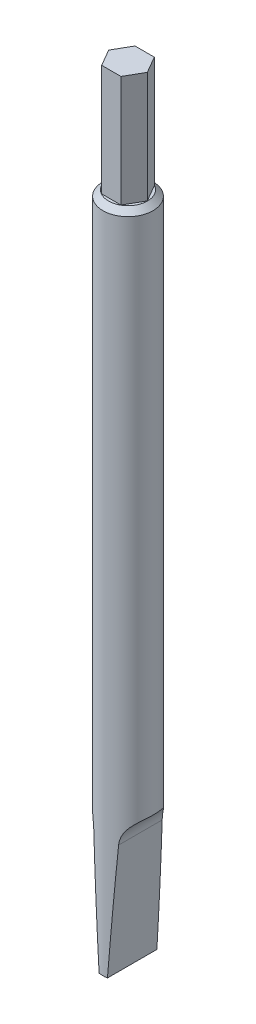
ISO-10303-21;
HEADER;
FILE_DESCRIPTION(('STEP AP214'),'2;1');
FILE_NAME('part.step','',(''),(''),'','','');
FILE_SCHEMA(('AUTOMOTIVE_DESIGN { 1 0 10303 214 1 1 1 1 }'));
ENDSEC;
DATA;
#1=APPLICATION_CONTEXT('core data for automotive mechanical design processes');
#2=APPLICATION_PROTOCOL_DEFINITION('international standard','automotive_design',2000,#1);
#3=PRODUCT_CONTEXT('',#1,'mechanical');
#4=PRODUCT('Part','Part','',(#3));
#5=PRODUCT_RELATED_PRODUCT_CATEGORY('part','',(#4));
#6=PRODUCT_DEFINITION_FORMATION('','',#4);
#7=PRODUCT_DEFINITION_CONTEXT('part definition',#1,'design');
#8=PRODUCT_DEFINITION('design','',#6,#7);
#9=PRODUCT_DEFINITION_SHAPE('','',#8);
#10=(LENGTH_UNIT() NAMED_UNIT(*) SI_UNIT(.MILLI.,.METRE.));
#11=(NAMED_UNIT(*) PLANE_ANGLE_UNIT() SI_UNIT($,.RADIAN.));
#12=(NAMED_UNIT(*) SI_UNIT($,.STERADIAN.) SOLID_ANGLE_UNIT());
#13=UNCERTAINTY_MEASURE_WITH_UNIT(LENGTH_MEASURE(1.E-05),#10,'distance_accuracy_value','');
#14=(GEOMETRIC_REPRESENTATION_CONTEXT(3) GLOBAL_UNCERTAINTY_ASSIGNED_CONTEXT((#13)) GLOBAL_UNIT_ASSIGNED_CONTEXT((#10,
#11,#12)) REPRESENTATION_CONTEXT('',''));
#15=CARTESIAN_POINT('',(0.,0.,0.));
#16=DIRECTION('',(0.,0.,1.));
#17=DIRECTION('',(1.,0.,0.));
#18=AXIS2_PLACEMENT_3D('',#15,#16,#17);
#19=CARTESIAN_POINT('',(0.,20.,3.));
#20=DIRECTION('',(0.,0.,-1.));
#21=DIRECTION('',(-1.,0.,0.));
#22=AXIS2_PLACEMENT_3D('',#19,#20,#21);
#23=PLANE('',#22);
#24=DIRECTION('',(1.,0.,0.));
#25=VECTOR('',#24,1.);
#26=CARTESIAN_POINT('',(0.,0.,3.));
#27=LINE('',#26,#25);
#28=CARTESIAN_POINT('',(-1.73205080756885,0.,3.00000000000002));
#29=VERTEX_POINT('',#28);
#30=CARTESIAN_POINT('',(1.73205080756891,0.,2.99999999999998));
#31=VERTEX_POINT('',#30);
#32=EDGE_CURVE('E167',#29,#31,#27,.T.);
#33=ORIENTED_EDGE('',*,*,#32,.T.);
#34=DIRECTION('',(0.,-1.,0.));
#35=VECTOR('',#34,1.);
#36=CARTESIAN_POINT('',(1.73205080756891,20.,2.99999999999998));
#37=LINE('',#36,#35);
#38=CARTESIAN_POINT('',(1.73205080756891,20.,2.99999999999998));
#39=VERTEX_POINT('',#38);
#40=EDGE_CURVE('E198',#39,#31,#37,.T.);
#41=ORIENTED_EDGE('',*,*,#40,.F.);
#42=DIRECTION('',(1.,0.,0.));
#43=VECTOR('',#42,1.);
#44=CARTESIAN_POINT('',(0.,20.,3.));
#45=LINE('',#44,#43);
#46=CARTESIAN_POINT('',(-1.73205080756885,20.,3.00000000000002));
#47=VERTEX_POINT('',#46);
#48=EDGE_CURVE('E152',#47,#39,#45,.T.);
#49=ORIENTED_EDGE('',*,*,#48,.F.);
#50=DIRECTION('',(0.,-1.,0.));
#51=VECTOR('',#50,1.);
#52=CARTESIAN_POINT('',(-1.73205080756885,20.,3.00000000000002));
#53=LINE('',#52,#51);
#54=EDGE_CURVE('E166',#47,#29,#53,.T.);
#55=ORIENTED_EDGE('',*,*,#54,.T.);
#56=EDGE_LOOP('',(#33,#41,#49,#55));
#57=FACE_BOUND('',#56,.T.);
#58=ADVANCED_FACE('F44',(#57),#23,.F.);
#59=CARTESIAN_POINT('',(2.59807621135334,20.,1.49999999999999));
#60=DIRECTION('',(-0.866025403784442,0.,-0.499999999999995));
#61=DIRECTION('',(-0.499999999999995,0.,0.866025403784442));
#62=AXIS2_PLACEMENT_3D('',#59,#60,#61);
#63=PLANE('',#62);
#64=DIRECTION('',(0.499999999999995,0.,-0.866025403784442));
#65=VECTOR('',#64,1.);
#66=CARTESIAN_POINT('',(2.59807621135334,0.,1.49999999999999));
#67=LINE('',#66,#65);
#68=CARTESIAN_POINT('',(3.46410161513776,0.,0.));
#69=VERTEX_POINT('',#68);
#70=EDGE_CURVE('E170',#31,#69,#67,.T.);
#71=ORIENTED_EDGE('',*,*,#70,.T.);
#72=DIRECTION('',(0.,-1.,0.));
#73=VECTOR('',#72,1.);
#74=CARTESIAN_POINT('',(3.46410161513776,20.,0.));
#75=LINE('',#74,#73);
#76=CARTESIAN_POINT('',(3.46410161513776,20.,0.));
#77=VERTEX_POINT('',#76);
#78=EDGE_CURVE('E195',#77,#69,#75,.T.);
#79=ORIENTED_EDGE('',*,*,#78,.F.);
#80=DIRECTION('',(0.499999999999995,0.,-0.866025403784442));
#81=VECTOR('',#80,1.);
#82=CARTESIAN_POINT('',(2.59807621135334,20.,1.49999999999999));
#83=LINE('',#82,#81);
#84=EDGE_CURVE('E155',#39,#77,#83,.T.);
#85=ORIENTED_EDGE('',*,*,#84,.F.);
#86=ORIENTED_EDGE('',*,*,#40,.T.);
#87=EDGE_LOOP('',(#71,#79,#85,#86));
#88=FACE_BOUND('',#87,.T.);
#89=ADVANCED_FACE('F242',(#88),#63,.F.);
#90=CARTESIAN_POINT('',(2.59807621135331,20.,-1.5));
#91=DIRECTION('',(-0.866025403784438,0.,0.500000000000001));
#92=DIRECTION('',(0.500000000000001,0.,0.866025403784438));
#93=AXIS2_PLACEMENT_3D('',#90,#91,#92);
#94=PLANE('',#93);
#95=DIRECTION('',(-0.500000000000001,0.,-0.866025403784438));
#96=VECTOR('',#95,1.);
#97=CARTESIAN_POINT('',(2.59807621135331,0.,-1.5));
#98=LINE('',#97,#96);
#99=CARTESIAN_POINT('',(1.73205080756887,0.,-3.00000000000001));
#100=VERTEX_POINT('',#99);
#101=EDGE_CURVE('E173',#69,#100,#98,.T.);
#102=ORIENTED_EDGE('',*,*,#101,.T.);
#103=DIRECTION('',(0.,-1.,0.));
#104=VECTOR('',#103,1.);
#105=CARTESIAN_POINT('',(1.73205080756887,20.,-3.00000000000001));
#106=LINE('',#105,#104);
#107=CARTESIAN_POINT('',(1.73205080756887,20.,-3.00000000000001));
#108=VERTEX_POINT('',#107);
#109=EDGE_CURVE('E192',#108,#100,#106,.T.);
#110=ORIENTED_EDGE('',*,*,#109,.F.);
#111=DIRECTION('',(-0.500000000000001,0.,-0.866025403784438));
#112=VECTOR('',#111,1.);
#113=CARTESIAN_POINT('',(2.59807621135331,20.,-1.5));
#114=LINE('',#113,#112);
#115=EDGE_CURVE('E158',#77,#108,#114,.T.);
#116=ORIENTED_EDGE('',*,*,#115,.F.);
#117=ORIENTED_EDGE('',*,*,#78,.T.);
#118=EDGE_LOOP('',(#102,#110,#116,#117));
#119=FACE_BOUND('',#118,.T.);
#120=ADVANCED_FACE('F247',(#119),#94,.F.);
#121=CARTESIAN_POINT('',(0.,20.,-3.));
#122=DIRECTION('',(0.,0.,1.));
#123=DIRECTION('',(1.,0.,0.));
#124=AXIS2_PLACEMENT_3D('',#121,#122,#123);
#125=PLANE('',#124);
#126=DIRECTION('',(-1.,0.,0.));
#127=VECTOR('',#126,1.);
#128=CARTESIAN_POINT('',(0.,0.,-3.));
#129=LINE('',#128,#127);
#130=CARTESIAN_POINT('',(-1.73205080756889,0.,-3.));
#131=VERTEX_POINT('',#130);
#132=EDGE_CURVE('E176',#100,#131,#129,.T.);
#133=ORIENTED_EDGE('',*,*,#132,.T.);
#134=DIRECTION('',(0.,-1.,0.));
#135=VECTOR('',#134,1.);
#136=CARTESIAN_POINT('',(-1.73205080756889,20.,-3.));
#137=LINE('',#136,#135);
#138=CARTESIAN_POINT('',(-1.73205080756889,20.,-3.));
#139=VERTEX_POINT('',#138);
#140=EDGE_CURVE('E189',#139,#131,#137,.T.);
#141=ORIENTED_EDGE('',*,*,#140,.F.);
#142=DIRECTION('',(-1.,0.,0.));
#143=VECTOR('',#142,1.);
#144=CARTESIAN_POINT('',(0.,20.,-3.));
#145=LINE('',#144,#143);
#146=EDGE_CURVE('E160',#108,#139,#145,.T.);
#147=ORIENTED_EDGE('',*,*,#146,.F.);
#148=ORIENTED_EDGE('',*,*,#109,.T.);
#149=EDGE_LOOP('',(#133,#141,#147,#148));
#150=FACE_BOUND('',#149,.T.);
#151=ADVANCED_FACE('F253',(#150),#125,.F.);
#152=CARTESIAN_POINT('',(-2.59807621135333,20.,-1.49999999999998));
#153=DIRECTION('',(0.866025403784442,0.,0.499999999999995));
#154=DIRECTION('',(0.499999999999995,0.,-0.866025403784442));
#155=AXIS2_PLACEMENT_3D('',#152,#153,#154);
#156=PLANE('',#155);
#157=DIRECTION('',(-0.499999999999995,0.,0.866025403784442));
#158=VECTOR('',#157,1.);
#159=CARTESIAN_POINT('',(-2.59807621135333,0.,-1.49999999999998));
#160=LINE('',#159,#158);
#161=CARTESIAN_POINT('',(-3.46410161513776,0.,0.));
#162=VERTEX_POINT('',#161);
#163=EDGE_CURVE('E179',#131,#162,#160,.T.);
#164=ORIENTED_EDGE('',*,*,#163,.T.);
#165=DIRECTION('',(0.,-1.,0.));
#166=VECTOR('',#165,1.);
#167=CARTESIAN_POINT('',(-3.46410161513776,20.,0.));
#168=LINE('',#167,#166);
#169=CARTESIAN_POINT('',(-3.46410161513776,20.,0.));
#170=VERTEX_POINT('',#169);
#171=EDGE_CURVE('E186',#170,#162,#168,.T.);
#172=ORIENTED_EDGE('',*,*,#171,.F.);
#173=DIRECTION('',(-0.499999999999995,0.,0.866025403784442));
#174=VECTOR('',#173,1.);
#175=CARTESIAN_POINT('',(-2.59807621135333,20.,-1.49999999999998));
#176=LINE('',#175,#174);
#177=EDGE_CURVE('E162',#139,#170,#176,.T.);
#178=ORIENTED_EDGE('',*,*,#177,.F.);
#179=ORIENTED_EDGE('',*,*,#140,.T.);
#180=EDGE_LOOP('',(#164,#172,#178,#179));
#181=FACE_BOUND('',#180,.T.);
#182=ADVANCED_FACE('F257',(#181),#156,.F.);
#183=CARTESIAN_POINT('',(-2.5980762113533,20.,1.50000000000002));
#184=DIRECTION('',(0.866025403784434,0.,-0.500000000000007));
#185=DIRECTION('',(-0.500000000000007,0.,-0.866025403784435));
#186=AXIS2_PLACEMENT_3D('',#183,#184,#185);
#187=PLANE('',#186);
#188=DIRECTION('',(0.500000000000007,0.,0.866025403784435));
#189=VECTOR('',#188,1.);
#190=CARTESIAN_POINT('',(-2.5980762113533,0.,1.50000000000002));
#191=LINE('',#190,#189);
#192=EDGE_CURVE('E156',#162,#29,#191,.T.);
#193=ORIENTED_EDGE('',*,*,#192,.T.);
#194=ORIENTED_EDGE('',*,*,#54,.F.);
#195=DIRECTION('',(0.500000000000007,0.,0.866025403784435));
#196=VECTOR('',#195,1.);
#197=CARTESIAN_POINT('',(-2.5980762113533,20.,1.50000000000002));
#198=LINE('',#197,#196);
#199=EDGE_CURVE('E164',#170,#47,#198,.T.);
#200=ORIENTED_EDGE('',*,*,#199,.F.);
#201=ORIENTED_EDGE('',*,*,#171,.T.);
#202=EDGE_LOOP('',(#193,#194,#200,#201));
#203=FACE_BOUND('',#202,.T.);
#204=ADVANCED_FACE('F238',(#203),#187,.F.);
#205=CARTESIAN_POINT('',(0.,20.,0.));
#206=DIRECTION('',(0.,1.,0.));
#207=DIRECTION('',(0.,0.,1.));
#208=AXIS2_PLACEMENT_3D('',#205,#206,#207);
#209=PLANE('',#208);
#210=ORIENTED_EDGE('',*,*,#48,.T.);
#211=ORIENTED_EDGE('',*,*,#84,.T.);
#212=ORIENTED_EDGE('',*,*,#115,.T.);
#213=ORIENTED_EDGE('',*,*,#146,.T.);
#214=ORIENTED_EDGE('',*,*,#177,.T.);
#215=ORIENTED_EDGE('',*,*,#199,.T.);
#216=EDGE_LOOP('',(#210,#211,#212,#213,#214,#215));
#217=FACE_BOUND('',#216,.T.);
#218=ADVANCED_FACE('F230',(#217),#209,.T.);
#219=CARTESIAN_POINT('',(0.,0.,0.));
#220=DIRECTION('',(0.,1.,0.));
#221=DIRECTION('',(0.,0.,1.));
#222=AXIS2_PLACEMENT_3D('',#219,#220,#221);
#223=PLANE('',#222);
#224=CARTESIAN_POINT('',(0.,0.,0.));
#225=DIRECTION('',(0.,1.,0.));
#226=DIRECTION('',(0.,0.,1.));
#227=AXIS2_PLACEMENT_3D('',#224,#225,#226);
#228=CIRCLE('',#227,3.5);
#229=CARTESIAN_POINT('',(0.,0.,3.5));
#230=VERTEX_POINT('',#229);
#231=EDGE_CURVE('E201',#230,#230,#228,.T.);
#232=ORIENTED_EDGE('',*,*,#231,.T.);
#233=EDGE_LOOP('',(#232));
#234=FACE_BOUND('',#233,.T.);
#235=ORIENTED_EDGE('',*,*,#32,.F.);
#236=ORIENTED_EDGE('',*,*,#192,.F.);
#237=ORIENTED_EDGE('',*,*,#163,.F.);
#238=ORIENTED_EDGE('',*,*,#132,.F.);
#239=ORIENTED_EDGE('',*,*,#101,.F.);
#240=ORIENTED_EDGE('',*,*,#70,.F.);
#241=EDGE_LOOP('',(#235,#236,#237,#238,#239,#240));
#242=FACE_BOUND('',#241,.T.);
#243=ADVANCED_FACE('F228',(#234,#242),#223,.T.);
#244=CARTESIAN_POINT('',(0.,-120.,0.));
#245=DIRECTION('',(0.,1.,0.));
#246=DIRECTION('',(0.,0.,1.));
#247=AXIS2_PLACEMENT_3D('',#244,#245,#246);
#248=CYLINDRICAL_SURFACE('',#247,4.5);
#249=CARTESIAN_POINT('',(0.,-130.725499692534,0.));
#250=DIRECTION('',(-0.997564050259824,0.0697564737441254,0.));
#251=DIRECTION('',(0.0697564737441254,0.997564050259824,0.));
#252=AXIS2_PLACEMENT_3D('',#249,#250,#251);
#253=ELLIPSE('',#252,64.5101416179164,4.5);
#254=CARTESIAN_POINT('',(2.22904475760738,-98.8486745427175,3.90913794443008));
#255=VERTEX_POINT('',#254);
#256=CARTESIAN_POINT('',(0.75,-120.,4.43705983732471));
#257=VERTEX_POINT('',#256);
#258=EDGE_CURVE('E74',#255,#257,#253,.F.);
#259=ORIENTED_EDGE('',*,*,#258,.F.);
#260=CARTESIAN_POINT('',(2.22904475760738,-98.8486745427175,-3.90913794443008));
#261=CARTESIAN_POINT('',(2.23702621646611,-98.7342787867654,-3.90455301412368));
#262=CARTESIAN_POINT('',(2.24897237830165,-98.6202409171083,-3.89774124246853));
#263=CARTESIAN_POINT('',(2.28058564520321,-98.3935946749973,-3.87934716952942));
#264=CARTESIAN_POINT('',(2.30025513874391,-98.280986755894,-3.86776339242702));
#265=CARTESIAN_POINT('',(2.34719584400133,-98.0575363098172,-3.83945395370796));
#266=CARTESIAN_POINT('',(2.37449738593554,-97.9467027315231,-3.82270774842751));
#267=CARTESIAN_POINT('',(2.436298436684,-97.7280755292207,-3.78362142886619));
#268=CARTESIAN_POINT('',(2.47079727307929,-97.6202816222934,-3.76128183711757));
#269=CARTESIAN_POINT('',(2.54660406210751,-97.4082165609079,-3.71037687082037));
#270=CARTESIAN_POINT('',(2.5879331727381,-97.3039576056024,-3.68179205909015));
#271=CARTESIAN_POINT('',(2.67661907337466,-97.1001945116027,-3.61783051026291));
#272=CARTESIAN_POINT('',(2.72397536155994,-97.0006899780045,-3.58245433848763));
#273=CARTESIAN_POINT('',(2.8236902240112,-96.8075192575303,-3.50439309765484));
#274=CARTESIAN_POINT('',(2.87603716753399,-96.7138402977946,-3.46172484722608));
#275=CARTESIAN_POINT('',(2.9846830410643,-96.5329182426583,-3.36849906138687));
#276=CARTESIAN_POINT('',(3.0409815500217,-96.445674463597,-3.31794236581187));
#277=CARTESIAN_POINT('',(3.15218326142481,-96.2841591543176,-3.2123516689926));
#278=CARTESIAN_POINT('',(3.20691354791847,-96.2094077407047,-3.15786937601235));
#279=CARTESIAN_POINT('',(3.31737747759323,-96.0666193508308,-3.04161662066168));
#280=CARTESIAN_POINT('',(3.37311101683262,-95.9985816836744,-2.97984690966111));
#281=CARTESIAN_POINT('',(3.48426592602755,-95.8695508433399,-2.84907936053104));
#282=CARTESIAN_POINT('',(3.53968727940563,-95.8085580409603,-2.78008114230142));
#283=CARTESIAN_POINT('',(3.64887642748707,-95.6937825954873,-2.6351337042114));
#284=CARTESIAN_POINT('',(3.70264431849602,-95.6399995318489,-2.55918489021543));
#285=CARTESIAN_POINT('',(3.80240311983273,-95.5442692448825,-2.40814230508481));
#286=CARTESIAN_POINT('',(3.84865318926925,-95.5016872490807,-2.33362025159587));
#287=CARTESIAN_POINT('',(3.93788764806116,-95.4222911569372,-2.17966921272709));
#288=CARTESIAN_POINT('',(3.98087099331313,-95.3854789007471,-2.10023867309235));
#289=CARTESIAN_POINT('',(4.06277994182616,-95.3174332764952,-1.93704749879922));
#290=CARTESIAN_POINT('',(4.10170651974433,-95.2861985671095,-1.85328791148238));
#291=CARTESIAN_POINT('',(4.17488472425591,-95.229017157265,-1.68196842738293));
#292=CARTESIAN_POINT('',(4.20913455413967,-95.2030724872524,-1.59440708697675));
#293=CARTESIAN_POINT('',(4.27279286567596,-95.1559191061295,-1.4150627178379));
#294=CARTESIAN_POINT('',(4.30213927068602,-95.1347700620595,-1.32324199674026));
#295=CARTESIAN_POINT('',(4.35507754079025,-95.0973075393073,-1.13696065361347));
#296=CARTESIAN_POINT('',(4.37866744162889,-95.0809957107901,-1.04249914270451));
#297=CARTESIAN_POINT('',(4.41976539080912,-95.0529601985634,-0.851591587608721));
#298=CARTESIAN_POINT('',(4.43727323385288,-95.0412366697288,-0.755145476548752));
#299=CARTESIAN_POINT('',(4.46598738167682,-95.0221761964408,-0.560890393805394));
#300=CARTESIAN_POINT('',(4.47719343889635,-95.0148394243169,-0.463081368735668));
#301=CARTESIAN_POINT('',(4.49360841061999,-95.0041316886795,-0.261310371063095));
#302=CARTESIAN_POINT('',(4.49845362158803,-95.001001013529,-0.157305834671433));
#303=CARTESIAN_POINT('',(4.50091605877074,-94.9994070035386,0.0507912499550183));
#304=CARTESIAN_POINT('',(4.49853547669683,-95.0009422534408,0.154883761930243));
#305=CARTESIAN_POINT('',(4.48657840402763,-95.0087117525025,0.362541163810522));
#306=CARTESIAN_POINT('',(4.47699769520908,-95.0149487562099,0.466105708581932));
#307=CARTESIAN_POINT('',(4.45076624447432,-95.0322505562378,0.671888596740986));
#308=CARTESIAN_POINT('',(4.43411819762719,-95.0433135122668,0.774107437997058));
#309=CARTESIAN_POINT('',(4.39361106688484,-95.0707334624376,0.978376392649346));
#310=CARTESIAN_POINT('',(4.36962505271902,-95.0871840351622,1.08038886357047));
#311=CARTESIAN_POINT('',(4.3149320162795,-95.1256145106216,1.28148931228229));
#312=CARTESIAN_POINT('',(4.28422761082077,-95.1475922610158,1.38057841172096));
#313=CARTESIAN_POINT('',(4.21660333411223,-95.1974328302393,1.57507265805744));
#314=CARTESIAN_POINT('',(4.1796845140855,-95.2252946539282,1.6704784246735));
#315=CARTESIAN_POINT('',(4.1002917134688,-95.287277239646,1.85684260853621));
#316=CARTESIAN_POINT('',(4.05781801371184,-95.3213976852984,1.94780125029294));
#317=CARTESIAN_POINT('',(3.96980587526507,-95.3948568070534,2.12126105031413));
#318=CARTESIAN_POINT('',(3.92443872232139,-95.4339560171983,2.20395054168733));
#319=CARTESIAN_POINT('',(3.8301963641651,-95.5185327371687,2.36394116852968));
#320=CARTESIAN_POINT('',(3.7813199692283,-95.5640124151713,2.44124045890578));
#321=CARTESIAN_POINT('',(3.68113041341151,-95.6614341851423,2.58984633123178));
#322=CARTESIAN_POINT('',(3.62981927482606,-95.7133709699943,2.66115775490605));
#323=CARTESIAN_POINT('',(3.52580828649944,-95.8237571580948,2.79750455439799));
#324=CARTESIAN_POINT('',(3.4731079509501,-95.8822088633403,2.86253769658988));
#325=CARTESIAN_POINT('',(3.3701354264968,-96.0023647883848,2.98297651089297));
#326=CARTESIAN_POINT('',(3.31987400410267,-96.0637589014692,3.0387014359611));
#327=CARTESIAN_POINT('',(3.22010235349994,-96.1920464231747,3.1442355074177));
#328=CARTESIAN_POINT('',(3.17059239777906,-96.2589417727001,3.19404255062077));
#329=CARTESIAN_POINT('',(3.07327174497451,-96.3978454439556,3.287790567114));
#330=CARTESIAN_POINT('',(3.02546067731883,-96.4698526402567,3.33173282550276));
#331=CARTESIAN_POINT('',(2.93234054623074,-96.6185905027541,3.41397726201644));
#332=CARTESIAN_POINT('',(2.88703240237243,-96.6953228833739,3.45227737571841));
#333=CARTESIAN_POINT('',(2.79834911591696,-96.855377294842,3.52457291290428));
#334=CARTESIAN_POINT('',(2.75507290609889,-96.9388280265469,3.55840449081346));
#335=CARTESIAN_POINT('',(2.67261260417686,-97.109689319816,3.62074796646077));
#336=CARTESIAN_POINT('',(2.63343032729214,-97.1971016134856,3.64925750881823));
#337=CARTESIAN_POINT('',(2.55970296754422,-97.3753297429375,3.70134563535071));
#338=CARTESIAN_POINT('',(2.52515999339455,-97.4661471026037,3.72492197992573));
#339=CARTESIAN_POINT('',(2.46115721426346,-97.6505978419933,3.76751692246677));
#340=CARTESIAN_POINT('',(2.43169749165586,-97.7442312673221,3.7865354465755));
#341=CARTESIAN_POINT('',(2.38186601038426,-97.9207414664065,3.81804381376264));
#342=CARTESIAN_POINT('',(2.36080172872799,-98.0033285244547,3.83107165117266));
#343=CARTESIAN_POINT('',(2.32285508466957,-98.1698579279807,3.85419730016856));
#344=CARTESIAN_POINT('',(2.30597247690759,-98.2538001936336,3.86429528366966));
#345=CARTESIAN_POINT('',(2.27654460459327,-98.4225084552288,3.88170608285833));
#346=CARTESIAN_POINT('',(2.26398868533907,-98.5072718914801,3.88902574489354));
#347=CARTESIAN_POINT('',(2.24323185058371,-98.6775140433747,3.90102964912072));
#348=CARTESIAN_POINT('',(2.23503083893253,-98.7629927431838,3.90571394949778));
#349=CARTESIAN_POINT('',(2.22904475760738,-98.8486745427175,3.90913794443008));
#350=B_SPLINE_CURVE_WITH_KNOTS('',3,(#260,#261,#262,#263,#264,#265,#266,#267,#268,#269,#270,
#271,#272,#273,#274,#275,#276,#277,#278,#279,#280,#281,#282,#283,#284,#285,#286,#287,#288,#289,
#290,#291,#292,#293,#294,#295,#296,#297,#298,#299,#300,#301,#302,#303,#304,#305,#306,#307,#308,
#309,#310,#311,#312,#313,#314,#315,#316,#317,#318,#319,#320,#321,#322,#323,#324,#325,#326,#327,
#328,#329,#330,#331,#332,#333,#334,#335,#336,#337,#338,#339,#340,#341,#342,#343,#344,#345,#346,
#347,#348,#349),.UNSPECIFIED.,.F.,.F.,(4,2,2,2,2,2,2,2,2,2,2,2,2,2,2,2,2,2,2,2,2,2,2,2,2,2,2,2,
2,2,2,2,2,2,2,2,2,2,2,2,2,2,2,2,4),(0.,0.344218673375672,0.688543881854524,1.03425740296899,
1.37993863968712,1.7267114781845,2.07345546336158,2.41941024420027,2.76532821840729,
3.08731527466596,3.40926916138795,3.73123998607421,4.05319202197876,4.34533978740256,
4.63758053917148,4.92975091609511,5.22203322490096,5.51777376437478,5.81361507685571,
6.10946637439177,6.40532929339913,6.71746313275976,7.02950230584356,7.34172443098342,
7.65382759968232,7.97166795893523,8.2893847389732,8.60704782832532,8.92469486407721,
9.23060206706399,9.53661347476197,9.84237501312736,10.1482449345382,10.4387759573691,
10.7294099265599,11.0199801067686,11.3106563419917,11.6100631974403,11.909602249263,
12.2092769938196,12.5089565941335,12.7674602840362,13.0259488026335,13.283796152694,
13.5416378096236),.UNSPECIFIED.);
#351=CARTESIAN_POINT('',(2.22904475760738,-98.8486745427175,-3.90913794443008));
#352=VERTEX_POINT('',#351);
#353=EDGE_CURVE('E12',#352,#255,#350,.T.);
#354=ORIENTED_EDGE('',*,*,#353,.F.);
#355=CARTESIAN_POINT('',(0.75,-120.,-4.43705983732471));
#356=VERTEX_POINT('',#355);
#357=EDGE_CURVE('E144',#356,#352,#253,.F.);
#358=ORIENTED_EDGE('',*,*,#357,.F.);
#359=CARTESIAN_POINT('',(0.,-120.,0.));
#360=DIRECTION('',(0.,1.,0.));
#361=DIRECTION('',(0.,0.,1.));
#362=AXIS2_PLACEMENT_3D('',#359,#360,#361);
#363=CIRCLE('',#362,4.5);
#364=CARTESIAN_POINT('',(-0.75,-120.,-4.43705983732471));
#365=VERTEX_POINT('',#364);
#366=EDGE_CURVE('E143',#356,#365,#363,.T.);
#367=ORIENTED_EDGE('',*,*,#366,.T.);
#368=CARTESIAN_POINT('',(0.,-130.725499692534,0.));
#369=DIRECTION('',(0.997564050259824,0.0697564737441254,0.));
#370=DIRECTION('',(-0.0697564737441254,0.997564050259824,0.));
#371=AXIS2_PLACEMENT_3D('',#368,#369,#370);
#372=ELLIPSE('',#371,64.5101416179164,4.5);
#373=CARTESIAN_POINT('',(-2.22904475760738,-98.8486745427175,-3.90913794443008));
#374=VERTEX_POINT('',#373);
#375=EDGE_CURVE('E66',#374,#365,#372,.F.);
#376=ORIENTED_EDGE('',*,*,#375,.F.);
#377=CARTESIAN_POINT('',(-2.22904475760738,-98.8486745427175,3.90913794443008));
#378=CARTESIAN_POINT('',(-2.23702621646611,-98.7342787867654,3.90455301412368));
#379=CARTESIAN_POINT('',(-2.24897237830165,-98.6202409171083,3.89774124246853));
#380=CARTESIAN_POINT('',(-2.28058564520321,-98.3935946749973,3.87934716952942));
#381=CARTESIAN_POINT('',(-2.30025513874391,-98.280986755894,3.86776339242702));
#382=CARTESIAN_POINT('',(-2.34719584400133,-98.0575363098172,3.83945395370796));
#383=CARTESIAN_POINT('',(-2.37449738593554,-97.9467027315231,3.82270774842751));
#384=CARTESIAN_POINT('',(-2.436298436684,-97.7280755292207,3.78362142886619));
#385=CARTESIAN_POINT('',(-2.47079727307929,-97.6202816222934,3.76128183711757));
#386=CARTESIAN_POINT('',(-2.54660406210751,-97.4082165609079,3.71037687082037));
#387=CARTESIAN_POINT('',(-2.5879331727381,-97.3039576056024,3.68179205909015));
#388=CARTESIAN_POINT('',(-2.67661907337466,-97.1001945116027,3.61783051026291));
#389=CARTESIAN_POINT('',(-2.72397536155994,-97.0006899780045,3.58245433848763));
#390=CARTESIAN_POINT('',(-2.8236902240112,-96.8075192575303,3.50439309765484));
#391=CARTESIAN_POINT('',(-2.87603716753399,-96.7138402977946,3.46172484722608));
#392=CARTESIAN_POINT('',(-2.9846830410643,-96.5329182426583,3.36849906138687));
#393=CARTESIAN_POINT('',(-3.0409815500217,-96.445674463597,3.31794236581187));
#394=CARTESIAN_POINT('',(-3.15218326142481,-96.2841591543176,3.2123516689926));
#395=CARTESIAN_POINT('',(-3.20691354791847,-96.2094077407047,3.15786937601235));
#396=CARTESIAN_POINT('',(-3.31737747759323,-96.0666193508308,3.04161662066168));
#397=CARTESIAN_POINT('',(-3.37311101683262,-95.9985816836744,2.97984690966111));
#398=CARTESIAN_POINT('',(-3.48426592602755,-95.8695508433399,2.84907936053104));
#399=CARTESIAN_POINT('',(-3.53968727940563,-95.8085580409603,2.78008114230142));
#400=CARTESIAN_POINT('',(-3.64887642748707,-95.6937825954873,2.6351337042114));
#401=CARTESIAN_POINT('',(-3.70264431849602,-95.6399995318489,2.55918489021543));
#402=CARTESIAN_POINT('',(-3.80240311983273,-95.5442692448825,2.40814230508481));
#403=CARTESIAN_POINT('',(-3.84865318926925,-95.5016872490807,2.33362025159587));
#404=CARTESIAN_POINT('',(-3.93788764806116,-95.4222911569372,2.17966921272709));
#405=CARTESIAN_POINT('',(-3.98087099331313,-95.3854789007471,2.10023867309235));
#406=CARTESIAN_POINT('',(-4.06277994182616,-95.3174332764952,1.93704749879922));
#407=CARTESIAN_POINT('',(-4.10170651974433,-95.2861985671095,1.85328791148238));
#408=CARTESIAN_POINT('',(-4.17488472425591,-95.229017157265,1.68196842738293));
#409=CARTESIAN_POINT('',(-4.20913455413967,-95.2030724872524,1.59440708697675));
#410=CARTESIAN_POINT('',(-4.27279286567596,-95.1559191061295,1.4150627178379));
#411=CARTESIAN_POINT('',(-4.30213927068602,-95.1347700620595,1.32324199674026));
#412=CARTESIAN_POINT('',(-4.35507754079025,-95.0973075393073,1.13696065361347));
#413=CARTESIAN_POINT('',(-4.37866744162889,-95.0809957107901,1.04249914270451));
#414=CARTESIAN_POINT('',(-4.41976539080912,-95.0529601985634,0.851591587608721));
#415=CARTESIAN_POINT('',(-4.43727323385288,-95.0412366697288,0.755145476548752));
#416=CARTESIAN_POINT('',(-4.46598738167682,-95.0221761964408,0.560890393805394));
#417=CARTESIAN_POINT('',(-4.47719343889635,-95.0148394243169,0.463081368735668));
#418=CARTESIAN_POINT('',(-4.49360841061999,-95.0041316886795,0.261310371063095));
#419=CARTESIAN_POINT('',(-4.49845362158803,-95.001001013529,0.157305834671433));
#420=CARTESIAN_POINT('',(-4.50091605877074,-94.9994070035386,-0.0507912499550183));
#421=CARTESIAN_POINT('',(-4.49853547669683,-95.0009422534408,-0.154883761930243));
#422=CARTESIAN_POINT('',(-4.48657840402763,-95.0087117525025,-0.362541163810522));
#423=CARTESIAN_POINT('',(-4.47699769520908,-95.0149487562099,-0.466105708581932));
#424=CARTESIAN_POINT('',(-4.45076624447432,-95.0322505562378,-0.671888596740986));
#425=CARTESIAN_POINT('',(-4.43411819762719,-95.0433135122668,-0.774107437997058));
#426=CARTESIAN_POINT('',(-4.39361106688484,-95.0707334624376,-0.978376392649346));
#427=CARTESIAN_POINT('',(-4.36962505271902,-95.0871840351622,-1.08038886357047));
#428=CARTESIAN_POINT('',(-4.3149320162795,-95.1256145106216,-1.28148931228229));
#429=CARTESIAN_POINT('',(-4.28422761082077,-95.1475922610158,-1.38057841172096));
#430=CARTESIAN_POINT('',(-4.21660333411223,-95.1974328302393,-1.57507265805744));
#431=CARTESIAN_POINT('',(-4.1796845140855,-95.2252946539282,-1.6704784246735));
#432=CARTESIAN_POINT('',(-4.1002917134688,-95.287277239646,-1.85684260853621));
#433=CARTESIAN_POINT('',(-4.05781801371184,-95.3213976852984,-1.94780125029294));
#434=CARTESIAN_POINT('',(-3.96980587526507,-95.3948568070534,-2.12126105031413));
#435=CARTESIAN_POINT('',(-3.92443872232139,-95.4339560171983,-2.20395054168733));
#436=CARTESIAN_POINT('',(-3.8301963641651,-95.5185327371687,-2.36394116852968));
#437=CARTESIAN_POINT('',(-3.7813199692283,-95.5640124151713,-2.44124045890578));
#438=CARTESIAN_POINT('',(-3.68113041341151,-95.6614341851423,-2.58984633123178));
#439=CARTESIAN_POINT('',(-3.62981927482606,-95.7133709699943,-2.66115775490605));
#440=CARTESIAN_POINT('',(-3.52580828649944,-95.8237571580948,-2.79750455439799));
#441=CARTESIAN_POINT('',(-3.4731079509501,-95.8822088633403,-2.86253769658988));
#442=CARTESIAN_POINT('',(-3.3701354264968,-96.0023647883848,-2.98297651089297));
#443=CARTESIAN_POINT('',(-3.31987400410267,-96.0637589014692,-3.0387014359611));
#444=CARTESIAN_POINT('',(-3.22010235349994,-96.1920464231747,-3.1442355074177));
#445=CARTESIAN_POINT('',(-3.17059239777906,-96.2589417727001,-3.19404255062077));
#446=CARTESIAN_POINT('',(-3.07327174497451,-96.3978454439556,-3.287790567114));
#447=CARTESIAN_POINT('',(-3.02546067731883,-96.4698526402567,-3.33173282550276));
#448=CARTESIAN_POINT('',(-2.93234054623074,-96.6185905027541,-3.41397726201644));
#449=CARTESIAN_POINT('',(-2.88703240237243,-96.6953228833739,-3.45227737571841));
#450=CARTESIAN_POINT('',(-2.79834911591696,-96.855377294842,-3.52457291290428));
#451=CARTESIAN_POINT('',(-2.75507290609889,-96.9388280265469,-3.55840449081346));
#452=CARTESIAN_POINT('',(-2.67261260417686,-97.109689319816,-3.62074796646077));
#453=CARTESIAN_POINT('',(-2.63343032729214,-97.1971016134856,-3.64925750881823));
#454=CARTESIAN_POINT('',(-2.55970296754422,-97.3753297429375,-3.70134563535071));
#455=CARTESIAN_POINT('',(-2.52515999339455,-97.4661471026037,-3.72492197992573));
#456=CARTESIAN_POINT('',(-2.46115721426346,-97.6505978419933,-3.76751692246677));
#457=CARTESIAN_POINT('',(-2.43169749165586,-97.7442312673221,-3.7865354465755));
#458=CARTESIAN_POINT('',(-2.38186601038426,-97.9207414664065,-3.81804381376264));
#459=CARTESIAN_POINT('',(-2.36080172872799,-98.0033285244547,-3.83107165117266));
#460=CARTESIAN_POINT('',(-2.32285508466957,-98.1698579279807,-3.85419730016856));
#461=CARTESIAN_POINT('',(-2.30597247690759,-98.2538001936336,-3.86429528366966));
#462=CARTESIAN_POINT('',(-2.27654460459327,-98.4225084552288,-3.88170608285833));
#463=CARTESIAN_POINT('',(-2.26398868533907,-98.5072718914801,-3.88902574489354));
#464=CARTESIAN_POINT('',(-2.24323185058371,-98.6775140433747,-3.90102964912072));
#465=CARTESIAN_POINT('',(-2.23503083893253,-98.7629927431838,-3.90571394949778));
#466=CARTESIAN_POINT('',(-2.22904475760738,-98.8486745427175,-3.90913794443008));
#467=B_SPLINE_CURVE_WITH_KNOTS('',3,(#377,#378,#379,#380,#381,#382,#383,#384,#385,#386,#387,
#388,#389,#390,#391,#392,#393,#394,#395,#396,#397,#398,#399,#400,#401,#402,#403,#404,#405,#406,
#407,#408,#409,#410,#411,#412,#413,#414,#415,#416,#417,#418,#419,#420,#421,#422,#423,#424,#425,
#426,#427,#428,#429,#430,#431,#432,#433,#434,#435,#436,#437,#438,#439,#440,#441,#442,#443,#444,
#445,#446,#447,#448,#449,#450,#451,#452,#453,#454,#455,#456,#457,#458,#459,#460,#461,#462,#463,
#464,#465,#466),.UNSPECIFIED.,.F.,.F.,(4,2,2,2,2,2,2,2,2,2,2,2,2,2,2,2,2,2,2,2,2,2,2,2,2,2,2,2,
2,2,2,2,2,2,2,2,2,2,2,2,2,2,2,2,4),(0.,0.344218673375672,0.688543881854524,1.03425740296899,
1.37993863968712,1.7267114781845,2.07345546336158,2.41941024420027,2.76532821840729,
3.08731527466596,3.40926916138795,3.73123998607421,4.05319202197876,4.34533978740256,
4.63758053917148,4.92975091609511,5.22203322490096,5.51777376437478,5.81361507685571,
6.10946637439177,6.40532929339913,6.71746313275976,7.02950230584356,7.34172443098342,
7.65382759968232,7.97166795893523,8.2893847389732,8.60704782832532,8.92469486407721,
9.23060206706399,9.53661347476197,9.84237501312736,10.1482449345382,10.4387759573691,
10.7294099265599,11.0199801067686,11.3106563419917,11.6100631974403,11.909602249263,
12.2092769938196,12.5089565941335,12.7674602840362,13.0259488026335,13.283796152694,
13.5416378096236),.UNSPECIFIED.);
#468=CARTESIAN_POINT('',(-2.22904475760738,-98.8486745427175,3.90913794443008));
#469=VERTEX_POINT('',#468);
#470=EDGE_CURVE('E59',#469,#374,#467,.T.);
#471=ORIENTED_EDGE('',*,*,#470,.F.);
#472=CARTESIAN_POINT('',(-0.75,-120.,4.43705983732471));
#473=VERTEX_POINT('',#472);
#474=EDGE_CURVE('E135',#473,#469,#372,.F.);
#475=ORIENTED_EDGE('',*,*,#474,.F.);
#476=EDGE_CURVE('E149',#473,#257,#363,.T.);
#477=ORIENTED_EDGE('',*,*,#476,.T.);
#478=EDGE_LOOP('',(#259,#354,#358,#367,#376,#471,#475,#477));
#479=FACE_BOUND('',#478,.T.);
#480=CARTESIAN_POINT('',(0.,-1.,0.));
#481=DIRECTION('',(0.,1.,0.));
#482=DIRECTION('',(0.,0.,1.));
#483=AXIS2_PLACEMENT_3D('',#480,#481,#482);
#484=CIRCLE('',#483,4.5);
#485=CARTESIAN_POINT('',(0.,-1.,4.5));
#486=VERTEX_POINT('',#485);
#487=EDGE_CURVE('E204',#486,#486,#484,.F.);
#488=ORIENTED_EDGE('',*,*,#487,.T.);
#489=EDGE_LOOP('',(#488));
#490=FACE_BOUND('',#489,.T.);
#491=ADVANCED_FACE('F139',(#479,#490),#248,.T.);
#492=CARTESIAN_POINT('',(0.,-120.,0.));
#493=DIRECTION('',(0.,1.,0.));
#494=DIRECTION('',(0.,0.,1.));
#495=AXIS2_PLACEMENT_3D('',#492,#493,#494);
#496=PLANE('',#495);
#497=ORIENTED_EDGE('',*,*,#366,.F.);
#498=DIRECTION('',(0.,0.,1.));
#499=VECTOR('',#498,1.);
#500=CARTESIAN_POINT('',(0.75,-120.,0.));
#501=LINE('',#500,#499);
#502=EDGE_CURVE('E133',#356,#257,#501,.T.);
#503=ORIENTED_EDGE('',*,*,#502,.T.);
#504=ORIENTED_EDGE('',*,*,#476,.F.);
#505=DIRECTION('',(0.,0.,-1.));
#506=VECTOR('',#505,1.);
#507=CARTESIAN_POINT('',(-0.75,-120.,0.));
#508=LINE('',#507,#506);
#509=EDGE_CURVE('E207',#473,#365,#508,.T.);
#510=ORIENTED_EDGE('',*,*,#509,.T.);
#511=EDGE_LOOP('',(#497,#503,#504,#510));
#512=FACE_BOUND('',#511,.T.);
#513=ADVANCED_FACE('F225',(#512),#496,.F.);
#514=CARTESIAN_POINT('',(0.,0.,0.));
#515=DIRECTION('',(0.,-1.,0.));
#516=DIRECTION('',(0.,0.,-1.));
#517=AXIS2_PLACEMENT_3D('',#514,#515,#516);
#518=CONICAL_SURFACE('',#517,3.5,0.785398163397446);
#519=ORIENTED_EDGE('',*,*,#487,.F.);
#520=EDGE_LOOP('',(#519));
#521=FACE_BOUND('',#520,.T.);
#522=ORIENTED_EDGE('',*,*,#231,.F.);
#523=EDGE_LOOP('',(#522));
#524=FACE_BOUND('',#523,.T.);
#525=ADVANCED_FACE('F47',(#521,#524),#518,.T.);
#526=CARTESIAN_POINT('',(-7.21686500890651,-99.1974569114381,-4.5));
#527=DIRECTION('',(0.,0.,1.));
#528=DIRECTION('',(1.,0.,0.));
#529=AXIS2_PLACEMENT_3D('',#526,#527,#528);
#530=CYLINDRICAL_SURFACE('',#529,5.);
#531=DIRECTION('',(0.,0.,1.));
#532=VECTOR('',#531,1.);
#533=CARTESIAN_POINT('',(-2.22904475760738,-98.8486745427175,-4.5));
#534=LINE('',#533,#532);
#535=EDGE_CURVE('E129',#374,#469,#534,.T.);
#536=ORIENTED_EDGE('',*,*,#535,.T.);
#537=ORIENTED_EDGE('',*,*,#470,.T.);
#538=EDGE_LOOP('',(#536,#537));
#539=FACE_BOUND('',#538,.T.);
#540=ADVANCED_FACE('F128',(#539),#530,.F.);
#541=CARTESIAN_POINT('',(-0.75,-120.,-4.5));
#542=DIRECTION('',(0.997564050259824,0.0697564737441254,0.));
#543=DIRECTION('',(-0.0697564737441254,0.997564050259824,0.));
#544=AXIS2_PLACEMENT_3D('',#541,#542,#543);
#545=PLANE('',#544);
#546=ORIENTED_EDGE('',*,*,#375,.T.);
#547=ORIENTED_EDGE('',*,*,#509,.F.);
#548=ORIENTED_EDGE('',*,*,#474,.T.);
#549=ORIENTED_EDGE('',*,*,#535,.F.);
#550=EDGE_LOOP('',(#546,#547,#548,#549));
#551=FACE_BOUND('',#550,.T.);
#552=ADVANCED_FACE('F134',(#551),#545,.F.);
#553=CARTESIAN_POINT('',(7.21686500890651,-99.1974569114381,-4.5));
#554=DIRECTION('',(0.,0.,1.));
#555=DIRECTION('',(1.,0.,0.));
#556=AXIS2_PLACEMENT_3D('',#553,#554,#555);
#557=CYLINDRICAL_SURFACE('',#556,5.);
#558=ORIENTED_EDGE('',*,*,#353,.T.);
#559=DIRECTION('',(0.,0.,1.));
#560=VECTOR('',#559,1.);
#561=CARTESIAN_POINT('',(2.22904475760738,-98.8486745427175,-4.5));
#562=LINE('',#561,#560);
#563=EDGE_CURVE('E136',#352,#255,#562,.T.);
#564=ORIENTED_EDGE('',*,*,#563,.F.);
#565=EDGE_LOOP('',(#558,#564));
#566=FACE_BOUND('',#565,.T.);
#567=ADVANCED_FACE('F220',(#566),#557,.F.);
#568=CARTESIAN_POINT('',(0.75,-120.,-4.5));
#569=DIRECTION('',(-0.997564050259824,0.0697564737441254,0.));
#570=DIRECTION('',(-0.0697564737441254,-0.997564050259824,0.));
#571=AXIS2_PLACEMENT_3D('',#568,#569,#570);
#572=PLANE('',#571);
#573=ORIENTED_EDGE('',*,*,#258,.T.);
#574=ORIENTED_EDGE('',*,*,#502,.F.);
#575=ORIENTED_EDGE('',*,*,#357,.T.);
#576=ORIENTED_EDGE('',*,*,#563,.T.);
#577=EDGE_LOOP('',(#573,#574,#575,#576));
#578=FACE_BOUND('',#577,.T.);
#579=ADVANCED_FACE('F348',(#578),#572,.F.);
#580=CLOSED_SHELL('',(#58,#89,#120,#151,#182,#204,#218,#243,#491,#513,#525,#540,#552,#567,#579));
#581=MANIFOLD_SOLID_BREP('B2',#580);
#582=ADVANCED_BREP_SHAPE_REPRESENTATION('',(#18,#581),#14);
#583=SHAPE_DEFINITION_REPRESENTATION(#9,#582);
ENDSEC;
END-ISO-10303-21;
